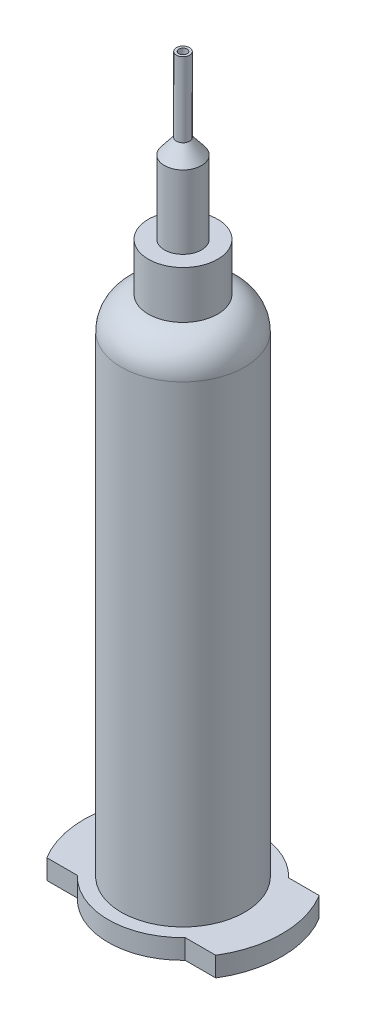
ISO-10303-21;
HEADER;
FILE_DESCRIPTION(('STEP AP214'),'2;1');
FILE_NAME('part.step','',(''),(''),'','','');
FILE_SCHEMA(('AUTOMOTIVE_DESIGN { 1 0 10303 214 1 1 1 1 }'));
ENDSEC;
DATA;
#1=APPLICATION_CONTEXT('core data for automotive mechanical design processes');
#2=APPLICATION_PROTOCOL_DEFINITION('international standard','automotive_design',2000,#1);
#3=PRODUCT_CONTEXT('',#1,'mechanical');
#4=PRODUCT('Part','Part','',(#3));
#5=PRODUCT_RELATED_PRODUCT_CATEGORY('part','',(#4));
#6=PRODUCT_DEFINITION_FORMATION('','',#4);
#7=PRODUCT_DEFINITION_CONTEXT('part definition',#1,'design');
#8=PRODUCT_DEFINITION('design','',#6,#7);
#9=PRODUCT_DEFINITION_SHAPE('','',#8);
#10=(LENGTH_UNIT() NAMED_UNIT(*) SI_UNIT(.MILLI.,.METRE.));
#11=(NAMED_UNIT(*) PLANE_ANGLE_UNIT() SI_UNIT($,.RADIAN.));
#12=(NAMED_UNIT(*) SI_UNIT($,.STERADIAN.) SOLID_ANGLE_UNIT());
#13=UNCERTAINTY_MEASURE_WITH_UNIT(LENGTH_MEASURE(1.E-05),#10,'distance_accuracy_value','');
#14=(GEOMETRIC_REPRESENTATION_CONTEXT(3) GLOBAL_UNCERTAINTY_ASSIGNED_CONTEXT((#13)) GLOBAL_UNIT_ASSIGNED_CONTEXT((#10,
#11,#12)) REPRESENTATION_CONTEXT('',''));
#15=CARTESIAN_POINT('',(0.,0.,0.));
#16=DIRECTION('',(0.,0.,1.));
#17=DIRECTION('',(1.,0.,0.));
#18=AXIS2_PLACEMENT_3D('',#15,#16,#17);
#19=CARTESIAN_POINT('',(0.,3.12000000000002,0.));
#20=DIRECTION('',(0.,1.,0.));
#21=DIRECTION('',(0.,0.,1.));
#22=AXIS2_PLACEMENT_3D('',#19,#20,#21);
#23=CYLINDRICAL_SURFACE('',#22,7.925);
#24=CARTESIAN_POINT('',(0.,3.12000000000002,0.));
#25=DIRECTION('',(0.,1.,0.));
#26=DIRECTION('',(0.,0.,1.));
#27=AXIS2_PLACEMENT_3D('',#24,#25,#26);
#28=CIRCLE('',#27,7.925);
#29=CARTESIAN_POINT('',(0.,3.12000000000002,7.925));
#30=VERTEX_POINT('',#29);
#31=EDGE_CURVE('E11',#30,#30,#28,.T.);
#32=ORIENTED_EDGE('',*,*,#31,.T.);
#33=EDGE_LOOP('',(#32));
#34=FACE_BOUND('',#33,.T.);
#35=CARTESIAN_POINT('',(0.,18.12,0.));
#36=DIRECTION('',(0.,1.,0.));
#37=DIRECTION('',(0.,0.,1.));
#38=AXIS2_PLACEMENT_3D('',#35,#36,#37);
#39=CIRCLE('',#38,7.925);
#40=CARTESIAN_POINT('',(0.,18.12,7.925));
#41=VERTEX_POINT('',#40);
#42=EDGE_CURVE('E52',#41,#41,#39,.T.);
#43=ORIENTED_EDGE('',*,*,#42,.F.);
#44=EDGE_LOOP('',(#43));
#45=FACE_BOUND('',#44,.T.);
#46=ADVANCED_FACE('F49',(#34,#45),#23,.T.);
#47=CARTESIAN_POINT('',(0.,3.12000000000002,0.));
#48=DIRECTION('',(0.,1.,0.));
#49=DIRECTION('',(0.,0.,1.));
#50=AXIS2_PLACEMENT_3D('',#47,#48,#49);
#51=PLANE('',#50);
#52=ORIENTED_EDGE('',*,*,#31,.F.);
#53=EDGE_LOOP('',(#52));
#54=FACE_BOUND('',#53,.T.);
#55=ADVANCED_FACE('F64',(#54),#51,.F.);
#56=CARTESIAN_POINT('',(0.,18.12,0.));
#57=DIRECTION('',(0.,1.,0.));
#58=DIRECTION('',(0.,0.,1.));
#59=AXIS2_PLACEMENT_3D('',#56,#57,#58);
#60=PLANE('',#59);
#61=ORIENTED_EDGE('',*,*,#42,.T.);
#62=EDGE_LOOP('',(#61));
#63=FACE_BOUND('',#62,.T.);
#64=ADVANCED_FACE('F61',(#63),#60,.T.);
#65=CLOSED_SHELL('',(#46,#55,#64));
#66=MANIFOLD_SOLID_BREP('B2',#65);
#67=CARTESIAN_POINT('',(0.,24.5223538498266,0.));
#68=DIRECTION('',(0.,1.,0.));
#69=DIRECTION('',(0.,0.,1.));
#70=AXIS2_PLACEMENT_3D('',#67,#68,#69);
#71=CYLINDRICAL_SURFACE('',#70,15.075);
#72=DIRECTION('',(0.,1.,0.));
#73=VECTOR('',#72,1.);
#74=CARTESIAN_POINT('',(-12.8545711713771,-82.5783145535444,-7.875));
#75=LINE('',#74,#73);
#76=CARTESIAN_POINT('',(-12.8545711713771,-55.88,-7.875));
#77=VERTEX_POINT('',#76);
#78=CARTESIAN_POINT('',(-12.8545711713771,-52.88,-7.875));
#79=VERTEX_POINT('',#78);
#80=EDGE_CURVE('E193',#77,#79,#75,.T.);
#81=ORIENTED_EDGE('',*,*,#80,.F.);
#82=CARTESIAN_POINT('',(0.,-55.88,0.));
#83=DIRECTION('',(0.,1.,0.));
#84=DIRECTION('',(0.,0.,1.));
#85=AXIS2_PLACEMENT_3D('',#82,#83,#84);
#86=CIRCLE('',#85,15.075);
#87=CARTESIAN_POINT('',(-12.8545711713772,-55.88,7.875));
#88=VERTEX_POINT('',#87);
#89=EDGE_CURVE('E182',#77,#88,#86,.T.);
#90=ORIENTED_EDGE('',*,*,#89,.T.);
#91=DIRECTION('',(0.,1.,0.));
#92=VECTOR('',#91,1.);
#93=CARTESIAN_POINT('',(-12.8545711713771,-82.5783145535444,7.875));
#94=LINE('',#93,#92);
#95=CARTESIAN_POINT('',(-12.8545711713771,-52.88,7.875));
#96=VERTEX_POINT('',#95);
#97=EDGE_CURVE('E111',#88,#96,#94,.T.);
#98=ORIENTED_EDGE('',*,*,#97,.T.);
#99=CARTESIAN_POINT('',(0.,-52.88,0.));
#100=DIRECTION('',(0.,1.,0.));
#101=DIRECTION('',(0.,0.,1.));
#102=AXIS2_PLACEMENT_3D('',#99,#100,#101);
#103=CIRCLE('',#102,15.075);
#104=EDGE_CURVE('E241',#79,#96,#103,.T.);
#105=ORIENTED_EDGE('',*,*,#104,.F.);
#106=EDGE_LOOP('',(#81,#90,#98,#105));
#107=FACE_BOUND('',#106,.T.);
#108=ADVANCED_FACE('F96',(#107),#71,.T.);
#109=CARTESIAN_POINT('',(0.,24.5223538498266,0.));
#110=DIRECTION('',(0.,1.,0.));
#111=DIRECTION('',(0.,0.,1.));
#112=AXIS2_PLACEMENT_3D('',#109,#110,#111);
#113=CYLINDRICAL_SURFACE('',#112,1.00000000000002);
#114=CARTESIAN_POINT('',(0.,44.53,0.));
#115=DIRECTION('',(0.,1.,0.));
#116=DIRECTION('',(0.,0.,1.));
#117=AXIS2_PLACEMENT_3D('',#114,#115,#116);
#118=CIRCLE('',#117,1.00000000000002);
#119=CARTESIAN_POINT('',(0.,44.53,1.00000000000002));
#120=VERTEX_POINT('',#119);
#121=EDGE_CURVE('E223',#120,#120,#118,.T.);
#122=ORIENTED_EDGE('',*,*,#121,.T.);
#123=EDGE_LOOP('',(#122));
#124=FACE_BOUND('',#123,.T.);
#125=CARTESIAN_POINT('',(0.,55.88,0.));
#126=DIRECTION('',(0.,1.,0.));
#127=DIRECTION('',(0.,0.,1.));
#128=AXIS2_PLACEMENT_3D('',#125,#126,#127);
#129=CIRCLE('',#128,1.00000000000001);
#130=CARTESIAN_POINT('',(0.,55.88,1.00000000000001));
#131=VERTEX_POINT('',#130);
#132=EDGE_CURVE('E196',#131,#131,#129,.T.);
#133=ORIENTED_EDGE('',*,*,#132,.F.);
#134=EDGE_LOOP('',(#133));
#135=FACE_BOUND('',#134,.T.);
#136=ADVANCED_FACE('F282',(#124,#135),#113,.T.);
#137=CARTESIAN_POINT('',(0.,55.88,0.));
#138=DIRECTION('',(0.,1.,0.));
#139=DIRECTION('',(0.,0.,1.));
#140=AXIS2_PLACEMENT_3D('',#137,#138,#139);
#141=PLANE('',#140);
#142=CARTESIAN_POINT('',(0.,55.88,0.));
#143=DIRECTION('',(0.,1.,0.));
#144=DIRECTION('',(0.,0.,1.));
#145=AXIS2_PLACEMENT_3D('',#142,#143,#144);
#146=CIRCLE('',#145,0.627370955077484);
#147=CARTESIAN_POINT('',(0.,55.88,0.627370955077484));
#148=VERTEX_POINT('',#147);
#149=EDGE_CURVE('E329',#148,#148,#146,.T.);
#150=ORIENTED_EDGE('',*,*,#149,.F.);
#151=EDGE_LOOP('',(#150));
#152=FACE_BOUND('',#151,.T.);
#153=ORIENTED_EDGE('',*,*,#132,.T.);
#154=EDGE_LOOP('',(#153));
#155=FACE_BOUND('',#154,.T.);
#156=ADVANCED_FACE('F280',(#152,#155),#141,.T.);
#157=CARTESIAN_POINT('',(0.,44.53,0.));
#158=DIRECTION('',(0.,-1.,0.));
#159=DIRECTION('',(0.,0.,-1.));
#160=AXIS2_PLACEMENT_3D('',#157,#158,#159);
#161=CONICAL_SURFACE('',#160,1.00000000000002,0.673903778153833);
#162=CARTESIAN_POINT('',(0.,42.2448308477729,0.));
#163=DIRECTION('',(0.,1.,0.));
#164=DIRECTION('',(0.,0.,1.));
#165=AXIS2_PLACEMENT_3D('',#162,#163,#164);
#166=CIRCLE('',#165,2.82500000000001);
#167=CARTESIAN_POINT('',(0.,42.2448308477729,2.82500000000001));
#168=VERTEX_POINT('',#167);
#169=EDGE_CURVE('E226',#168,#168,#166,.T.);
#170=ORIENTED_EDGE('',*,*,#169,.T.);
#171=EDGE_LOOP('',(#170));
#172=FACE_BOUND('',#171,.T.);
#173=ORIENTED_EDGE('',*,*,#121,.F.);
#174=EDGE_LOOP('',(#173));
#175=FACE_BOUND('',#174,.T.);
#176=ADVANCED_FACE('F274',(#172,#175),#161,.T.);
#177=CARTESIAN_POINT('',(0.,24.5223538498266,0.));
#178=DIRECTION('',(0.,1.,0.));
#179=DIRECTION('',(0.,0.,1.));
#180=AXIS2_PLACEMENT_3D('',#177,#178,#179);
#181=CYLINDRICAL_SURFACE('',#180,2.82500000000001);
#182=CARTESIAN_POINT('',(0.,31.12,0.));
#183=DIRECTION('',(0.,1.,0.));
#184=DIRECTION('',(0.,0.,1.));
#185=AXIS2_PLACEMENT_3D('',#182,#183,#184);
#186=CIRCLE('',#185,2.825);
#187=CARTESIAN_POINT('',(0.,31.12,2.825));
#188=VERTEX_POINT('',#187);
#189=EDGE_CURVE('E229',#188,#188,#186,.T.);
#190=ORIENTED_EDGE('',*,*,#189,.T.);
#191=EDGE_LOOP('',(#190));
#192=FACE_BOUND('',#191,.T.);
#193=ORIENTED_EDGE('',*,*,#169,.F.);
#194=EDGE_LOOP('',(#193));
#195=FACE_BOUND('',#194,.T.);
#196=ADVANCED_FACE('F268',(#192,#195),#181,.T.);
#197=CARTESIAN_POINT('',(0.,31.12,0.));
#198=DIRECTION('',(0.,1.,0.));
#199=DIRECTION('',(0.,0.,1.));
#200=AXIS2_PLACEMENT_3D('',#197,#198,#199);
#201=PLANE('',#200);
#202=CARTESIAN_POINT('',(0.,31.12,0.));
#203=DIRECTION('',(0.,1.,0.));
#204=DIRECTION('',(0.,0.,1.));
#205=AXIS2_PLACEMENT_3D('',#202,#203,#204);
#206=CIRCLE('',#205,5.27500000000001);
#207=CARTESIAN_POINT('',(0.,31.12,5.27500000000001));
#208=VERTEX_POINT('',#207);
#209=EDGE_CURVE('E232',#208,#208,#206,.T.);
#210=ORIENTED_EDGE('',*,*,#209,.T.);
#211=EDGE_LOOP('',(#210));
#212=FACE_BOUND('',#211,.T.);
#213=ORIENTED_EDGE('',*,*,#189,.F.);
#214=EDGE_LOOP('',(#213));
#215=FACE_BOUND('',#214,.T.);
#216=ADVANCED_FACE('F262',(#212,#215),#201,.T.);
#217=CARTESIAN_POINT('',(0.,24.5223538498266,0.));
#218=DIRECTION('',(0.,1.,0.));
#219=DIRECTION('',(0.,0.,1.));
#220=AXIS2_PLACEMENT_3D('',#217,#218,#219);
#221=CYLINDRICAL_SURFACE('',#220,5.27500000000001);
#222=CARTESIAN_POINT('',(0.,23.88,0.));
#223=DIRECTION('',(0.,1.,0.));
#224=DIRECTION('',(0.,0.,1.));
#225=AXIS2_PLACEMENT_3D('',#222,#223,#224);
#226=CIRCLE('',#225,5.27500000000001);
#227=CARTESIAN_POINT('',(0.,23.88,5.27500000000001));
#228=VERTEX_POINT('',#227);
#229=EDGE_CURVE('E235',#228,#228,#226,.T.);
#230=ORIENTED_EDGE('',*,*,#229,.T.);
#231=EDGE_LOOP('',(#230));
#232=FACE_BOUND('',#231,.T.);
#233=ORIENTED_EDGE('',*,*,#209,.F.);
#234=EDGE_LOOP('',(#233));
#235=FACE_BOUND('',#234,.T.);
#236=ADVANCED_FACE('F259',(#232,#235),#221,.T.);
#237=CARTESIAN_POINT('',(0.,24.5223538498266,0.));
#238=DIRECTION('',(0.,1.,0.));
#239=DIRECTION('',(0.,0.,1.));
#240=AXIS2_PLACEMENT_3D('',#237,#238,#239);
#241=CYLINDRICAL_SURFACE('',#240,9.40000000000001);
#242=CARTESIAN_POINT('',(0.,18.9571578331212,0.));
#243=DIRECTION('',(0.,1.,0.));
#244=DIRECTION('',(0.,0.,1.));
#245=AXIS2_PLACEMENT_3D('',#242,#243,#244);
#246=CIRCLE('',#245,9.40000000000001);
#247=CARTESIAN_POINT('',(0.,18.9571578331212,9.40000000000001));
#248=VERTEX_POINT('',#247);
#249=EDGE_CURVE('E104',#248,#248,#246,.F.);
#250=ORIENTED_EDGE('',*,*,#249,.T.);
#251=EDGE_LOOP('',(#250));
#252=FACE_BOUND('',#251,.T.);
#253=CARTESIAN_POINT('',(0.,-52.88,0.));
#254=DIRECTION('',(0.,1.,0.));
#255=DIRECTION('',(0.,0.,1.));
#256=AXIS2_PLACEMENT_3D('',#253,#254,#255);
#257=CIRCLE('',#256,9.40000000000002);
#258=CARTESIAN_POINT('',(0.,-52.88,9.40000000000002));
#259=VERTEX_POINT('',#258);
#260=EDGE_CURVE('E238',#259,#259,#257,.T.);
#261=ORIENTED_EDGE('',*,*,#260,.T.);
#262=EDGE_LOOP('',(#261));
#263=FACE_BOUND('',#262,.T.);
#264=ADVANCED_FACE('F250',(#252,#263),#241,.T.);
#265=CARTESIAN_POINT('',(0.,-52.88,0.));
#266=DIRECTION('',(0.,1.,0.));
#267=DIRECTION('',(0.,0.,1.));
#268=AXIS2_PLACEMENT_3D('',#265,#266,#267);
#269=PLANE('',#268);
#270=DIRECTION('',(1.,0.,0.));
#271=VECTOR('',#270,1.);
#272=CARTESIAN_POINT('',(-12.8545711713771,-52.88,-7.875));
#273=LINE('',#272,#271);
#274=CARTESIAN_POINT('',(-8.208227579691,-52.88,-7.875));
#275=VERTEX_POINT('',#274);
#276=EDGE_CURVE('E176',#79,#275,#273,.T.);
#277=ORIENTED_EDGE('',*,*,#276,.F.);
#278=ORIENTED_EDGE('',*,*,#104,.T.);
#279=DIRECTION('',(-1.,0.,0.));
#280=VECTOR('',#279,1.);
#281=CARTESIAN_POINT('',(-12.8545711713771,-52.88,7.875));
#282=LINE('',#281,#280);
#283=CARTESIAN_POINT('',(-8.208227579691,-52.88,7.875));
#284=VERTEX_POINT('',#283);
#285=EDGE_CURVE('E213',#284,#96,#282,.T.);
#286=ORIENTED_EDGE('',*,*,#285,.F.);
#287=CARTESIAN_POINT('',(0.,-52.88,0.));
#288=DIRECTION('',(0.,-1.,0.));
#289=DIRECTION('',(0.,0.,1.));
#290=AXIS2_PLACEMENT_3D('',#287,#288,#289);
#291=CIRCLE('',#290,11.375);
#292=CARTESIAN_POINT('',(8.208227579691,-52.88,7.875));
#293=VERTEX_POINT('',#292);
#294=EDGE_CURVE('E217',#293,#284,#291,.T.);
#295=ORIENTED_EDGE('',*,*,#294,.F.);
#296=DIRECTION('',(-1.,0.,0.));
#297=VECTOR('',#296,1.);
#298=CARTESIAN_POINT('',(8.208227579691,-52.88,7.875));
#299=LINE('',#298,#297);
#300=CARTESIAN_POINT('',(12.8545711713771,-52.88,7.875));
#301=VERTEX_POINT('',#300);
#302=EDGE_CURVE('E214',#301,#293,#299,.T.);
#303=ORIENTED_EDGE('',*,*,#302,.F.);
#304=CARTESIAN_POINT('',(12.8545711713771,-52.88,-7.875));
#305=VERTEX_POINT('',#304);
#306=EDGE_CURVE('E242',#301,#305,#103,.T.);
#307=ORIENTED_EDGE('',*,*,#306,.T.);
#308=DIRECTION('',(1.,0.,0.));
#309=VECTOR('',#308,1.);
#310=CARTESIAN_POINT('',(8.208227579691,-52.88,-7.875));
#311=LINE('',#310,#309);
#312=CARTESIAN_POINT('',(8.208227579691,-52.88,-7.875));
#313=VERTEX_POINT('',#312);
#314=EDGE_CURVE('E183',#313,#305,#311,.T.);
#315=ORIENTED_EDGE('',*,*,#314,.F.);
#316=CARTESIAN_POINT('',(0.,-52.88,0.));
#317=DIRECTION('',(0.,-1.,0.));
#318=DIRECTION('',(0.,0.,-1.));
#319=AXIS2_PLACEMENT_3D('',#316,#317,#318);
#320=CIRCLE('',#319,11.375);
#321=EDGE_CURVE('E185',#275,#313,#320,.T.);
#322=ORIENTED_EDGE('',*,*,#321,.F.);
#323=EDGE_LOOP('',(#277,#278,#286,#295,#303,#307,#315,#322));
#324=FACE_BOUND('',#323,.T.);
#325=ORIENTED_EDGE('',*,*,#260,.F.);
#326=EDGE_LOOP('',(#325));
#327=FACE_BOUND('',#326,.T.);
#328=ADVANCED_FACE('F306',(#324,#327),#269,.T.);
#329=DIRECTION('',(0.,1.,0.));
#330=VECTOR('',#329,1.);
#331=CARTESIAN_POINT('',(12.8545711713771,-82.5783145535444,-7.875));
#332=LINE('',#331,#330);
#333=CARTESIAN_POINT('',(12.8545711713772,-55.88,-7.875));
#334=VERTEX_POINT('',#333);
#335=EDGE_CURVE('E119',#334,#305,#332,.T.);
#336=ORIENTED_EDGE('',*,*,#335,.T.);
#337=ORIENTED_EDGE('',*,*,#306,.F.);
#338=DIRECTION('',(0.,1.,0.));
#339=VECTOR('',#338,1.);
#340=CARTESIAN_POINT('',(12.8545711713771,-82.5783145535444,7.875));
#341=LINE('',#340,#339);
#342=CARTESIAN_POINT('',(12.8545711713771,-55.88,7.875));
#343=VERTEX_POINT('',#342);
#344=EDGE_CURVE('E197',#343,#301,#341,.T.);
#345=ORIENTED_EDGE('',*,*,#344,.F.);
#346=EDGE_CURVE('E245',#343,#334,#86,.T.);
#347=ORIENTED_EDGE('',*,*,#346,.T.);
#348=EDGE_LOOP('',(#336,#337,#345,#347));
#349=FACE_BOUND('',#348,.T.);
#350=ADVANCED_FACE('F300',(#349),#71,.T.);
#351=CARTESIAN_POINT('',(0.,-55.88,0.));
#352=DIRECTION('',(0.,-1.,0.));
#353=DIRECTION('',(0.,0.,-1.));
#354=AXIS2_PLACEMENT_3D('',#351,#352,#353);
#355=PLANE('',#354);
#356=CARTESIAN_POINT('',(0.,-55.88,0.));
#357=DIRECTION('',(0.,-1.,0.));
#358=DIRECTION('',(0.,0.,-1.));
#359=AXIS2_PLACEMENT_3D('',#356,#357,#358);
#360=CIRCLE('',#359,7.925);
#361=CARTESIAN_POINT('',(0.,-55.88,-7.925));
#362=VERTEX_POINT('',#361);
#363=EDGE_CURVE('E326',#362,#362,#360,.T.);
#364=ORIENTED_EDGE('',*,*,#363,.F.);
#365=EDGE_LOOP('',(#364));
#366=FACE_BOUND('',#365,.T.);
#367=DIRECTION('',(1.,0.,0.));
#368=VECTOR('',#367,1.);
#369=CARTESIAN_POINT('',(-12.8545711713771,-55.88,-7.875));
#370=LINE('',#369,#368);
#371=CARTESIAN_POINT('',(-8.208227579691,-55.88,-7.875));
#372=VERTEX_POINT('',#371);
#373=EDGE_CURVE('E173',#77,#372,#370,.T.);
#374=ORIENTED_EDGE('',*,*,#373,.T.);
#375=CARTESIAN_POINT('',(0.,-55.88,0.));
#376=DIRECTION('',(0.,-1.,0.));
#377=DIRECTION('',(0.,0.,-1.));
#378=AXIS2_PLACEMENT_3D('',#375,#376,#377);
#379=CIRCLE('',#378,11.375);
#380=CARTESIAN_POINT('',(8.208227579691,-55.88,-7.875));
#381=VERTEX_POINT('',#380);
#382=EDGE_CURVE('E161',#372,#381,#379,.T.);
#383=ORIENTED_EDGE('',*,*,#382,.T.);
#384=DIRECTION('',(1.,0.,0.));
#385=VECTOR('',#384,1.);
#386=CARTESIAN_POINT('',(8.208227579691,-55.88,-7.875));
#387=LINE('',#386,#385);
#388=EDGE_CURVE('E190',#381,#334,#387,.T.);
#389=ORIENTED_EDGE('',*,*,#388,.T.);
#390=ORIENTED_EDGE('',*,*,#346,.F.);
#391=DIRECTION('',(-1.,0.,0.));
#392=VECTOR('',#391,1.);
#393=CARTESIAN_POINT('',(8.208227579691,-55.88,7.875));
#394=LINE('',#393,#392);
#395=CARTESIAN_POINT('',(8.208227579691,-55.88,7.875));
#396=VERTEX_POINT('',#395);
#397=EDGE_CURVE('E202',#343,#396,#394,.T.);
#398=ORIENTED_EDGE('',*,*,#397,.T.);
#399=CARTESIAN_POINT('',(0.,-55.88,0.));
#400=DIRECTION('',(0.,-1.,0.));
#401=DIRECTION('',(0.,0.,-1.));
#402=AXIS2_PLACEMENT_3D('',#399,#400,#401);
#403=CIRCLE('',#402,11.375);
#404=CARTESIAN_POINT('',(-8.208227579691,-55.88,7.875));
#405=VERTEX_POINT('',#404);
#406=EDGE_CURVE('E203',#396,#405,#403,.T.);
#407=ORIENTED_EDGE('',*,*,#406,.T.);
#408=DIRECTION('',(-1.,0.,0.));
#409=VECTOR('',#408,1.);
#410=CARTESIAN_POINT('',(-12.8545711713771,-55.88,7.875));
#411=LINE('',#410,#409);
#412=EDGE_CURVE('E206',#405,#88,#411,.T.);
#413=ORIENTED_EDGE('',*,*,#412,.T.);
#414=ORIENTED_EDGE('',*,*,#89,.F.);
#415=EDGE_LOOP('',(#374,#383,#389,#390,#398,#407,#413,#414));
#416=FACE_BOUND('',#415,.T.);
#417=ADVANCED_FACE('F180',(#366,#416),#355,.T.);
#418=CARTESIAN_POINT('',(0.,18.9571578331212,0.));
#419=DIRECTION('',(0.,1.,0.));
#420=DIRECTION('',(0.,0.,1.));
#421=AXIS2_PLACEMENT_3D('',#418,#419,#420);
#422=DEGENERATE_TOROIDAL_SURFACE('',#421,4.40000000000001,5.,.T.);
#423=ORIENTED_EDGE('',*,*,#249,.F.);
#424=EDGE_LOOP('',(#423));
#425=FACE_BOUND('',#424,.T.);
#426=ORIENTED_EDGE('',*,*,#229,.F.);
#427=EDGE_LOOP('',(#426));
#428=FACE_BOUND('',#427,.T.);
#429=ADVANCED_FACE('F253',(#425,#428),#422,.T.);
#430=CARTESIAN_POINT('',(8.208227579691,-82.5783145535444,7.875));
#431=DIRECTION('',(0.,0.,-1.));
#432=DIRECTION('',(-1.,0.,0.));
#433=AXIS2_PLACEMENT_3D('',#430,#431,#432);
#434=PLANE('',#433);
#435=ORIENTED_EDGE('',*,*,#344,.T.);
#436=ORIENTED_EDGE('',*,*,#302,.T.);
#437=DIRECTION('',(0.,1.,0.));
#438=VECTOR('',#437,1.);
#439=CARTESIAN_POINT('',(8.208227579691,-82.5783145535444,7.875));
#440=LINE('',#439,#438);
#441=EDGE_CURVE('E200',#396,#293,#440,.T.);
#442=ORIENTED_EDGE('',*,*,#441,.F.);
#443=ORIENTED_EDGE('',*,*,#397,.F.);
#444=EDGE_LOOP('',(#435,#436,#442,#443));
#445=FACE_BOUND('',#444,.T.);
#446=ADVANCED_FACE('F256',(#445),#434,.F.);
#447=CARTESIAN_POINT('',(0.,-82.5783145535444,0.));
#448=DIRECTION('',(0.,1.,0.));
#449=DIRECTION('',(0.,0.,1.));
#450=AXIS2_PLACEMENT_3D('',#447,#448,#449);
#451=CYLINDRICAL_SURFACE('',#450,11.375);
#452=ORIENTED_EDGE('',*,*,#441,.T.);
#453=ORIENTED_EDGE('',*,*,#294,.T.);
#454=DIRECTION('',(0.,1.,0.));
#455=VECTOR('',#454,1.);
#456=CARTESIAN_POINT('',(-8.208227579691,-82.5783145535444,7.875));
#457=LINE('',#456,#455);
#458=EDGE_CURVE('E204',#405,#284,#457,.T.);
#459=ORIENTED_EDGE('',*,*,#458,.F.);
#460=ORIENTED_EDGE('',*,*,#406,.F.);
#461=EDGE_LOOP('',(#452,#453,#459,#460));
#462=FACE_BOUND('',#461,.T.);
#463=ADVANCED_FACE('F356',(#462),#451,.T.);
#464=CARTESIAN_POINT('',(-12.8545711713771,-82.5783145535444,7.875));
#465=DIRECTION('',(0.,0.,-1.));
#466=DIRECTION('',(-1.,0.,0.));
#467=AXIS2_PLACEMENT_3D('',#464,#465,#466);
#468=PLANE('',#467);
#469=ORIENTED_EDGE('',*,*,#458,.T.);
#470=ORIENTED_EDGE('',*,*,#285,.T.);
#471=ORIENTED_EDGE('',*,*,#97,.F.);
#472=ORIENTED_EDGE('',*,*,#412,.F.);
#473=EDGE_LOOP('',(#469,#470,#471,#472));
#474=FACE_BOUND('',#473,.T.);
#475=ADVANCED_FACE('F353',(#474),#468,.F.);
#476=CARTESIAN_POINT('',(-12.8545711713771,-82.5783145535444,-7.875));
#477=DIRECTION('',(0.,0.,1.));
#478=DIRECTION('',(1.,0.,0.));
#479=AXIS2_PLACEMENT_3D('',#476,#477,#478);
#480=PLANE('',#479);
#481=ORIENTED_EDGE('',*,*,#80,.T.);
#482=ORIENTED_EDGE('',*,*,#276,.T.);
#483=DIRECTION('',(0.,1.,0.));
#484=VECTOR('',#483,1.);
#485=CARTESIAN_POINT('',(-8.208227579691,-82.5783145535444,-7.875));
#486=LINE('',#485,#484);
#487=EDGE_CURVE('E165',#372,#275,#486,.T.);
#488=ORIENTED_EDGE('',*,*,#487,.F.);
#489=ORIENTED_EDGE('',*,*,#373,.F.);
#490=EDGE_LOOP('',(#481,#482,#488,#489));
#491=FACE_BOUND('',#490,.T.);
#492=ADVANCED_FACE('F172',(#491),#480,.F.);
#493=CARTESIAN_POINT('',(0.,-82.5783145535444,0.));
#494=DIRECTION('',(0.,1.,0.));
#495=DIRECTION('',(0.,0.,1.));
#496=AXIS2_PLACEMENT_3D('',#493,#494,#495);
#497=CYLINDRICAL_SURFACE('',#496,11.375);
#498=ORIENTED_EDGE('',*,*,#487,.T.);
#499=ORIENTED_EDGE('',*,*,#321,.T.);
#500=DIRECTION('',(0.,1.,0.));
#501=VECTOR('',#500,1.);
#502=CARTESIAN_POINT('',(8.208227579691,-82.5783145535444,-7.875));
#503=LINE('',#502,#501);
#504=EDGE_CURVE('E167',#381,#313,#503,.T.);
#505=ORIENTED_EDGE('',*,*,#504,.F.);
#506=ORIENTED_EDGE('',*,*,#382,.F.);
#507=EDGE_LOOP('',(#498,#499,#505,#506));
#508=FACE_BOUND('',#507,.T.);
#509=ADVANCED_FACE('F163',(#508),#497,.T.);
#510=CARTESIAN_POINT('',(8.208227579691,-82.5783145535444,-7.875));
#511=DIRECTION('',(0.,0.,1.));
#512=DIRECTION('',(1.,0.,0.));
#513=AXIS2_PLACEMENT_3D('',#510,#511,#512);
#514=PLANE('',#513);
#515=ORIENTED_EDGE('',*,*,#504,.T.);
#516=ORIENTED_EDGE('',*,*,#314,.T.);
#517=ORIENTED_EDGE('',*,*,#335,.F.);
#518=ORIENTED_EDGE('',*,*,#388,.F.);
#519=EDGE_LOOP('',(#515,#516,#517,#518));
#520=FACE_BOUND('',#519,.T.);
#521=ADVANCED_FACE('F324',(#520),#514,.F.);
#522=CARTESIAN_POINT('',(0.,18.12,0.));
#523=DIRECTION('',(0.,-1.,0.));
#524=DIRECTION('',(0.,0.,-1.));
#525=AXIS2_PLACEMENT_3D('',#522,#523,#524);
#526=CYLINDRICAL_SURFACE('',#525,7.925);
#527=CARTESIAN_POINT('',(0.,18.12,0.));
#528=DIRECTION('',(0.,-1.,0.));
#529=DIRECTION('',(0.,0.,-1.));
#530=AXIS2_PLACEMENT_3D('',#527,#528,#529);
#531=CIRCLE('',#530,7.925);
#532=CARTESIAN_POINT('',(0.,18.12,-7.925));
#533=VERTEX_POINT('',#532);
#534=EDGE_CURVE('E199',#533,#533,#531,.T.);
#535=ORIENTED_EDGE('',*,*,#534,.F.);
#536=EDGE_LOOP('',(#535));
#537=FACE_BOUND('',#536,.T.);
#538=ORIENTED_EDGE('',*,*,#363,.T.);
#539=EDGE_LOOP('',(#538));
#540=FACE_BOUND('',#539,.T.);
#541=ADVANCED_FACE('F336',(#537,#540),#526,.F.);
#542=CARTESIAN_POINT('',(0.,14.88,0.));
#543=DIRECTION('',(0.,1.,0.));
#544=DIRECTION('',(0.,0.,1.));
#545=AXIS2_PLACEMENT_3D('',#542,#543,#544);
#546=CYLINDRICAL_SURFACE('',#545,0.627370955077484);
#547=CARTESIAN_POINT('',(0.,27.7479380565703,0.));
#548=DIRECTION('',(0.,-1.,0.));
#549=DIRECTION('',(0.,0.,-1.));
#550=AXIS2_PLACEMENT_3D('',#547,#548,#549);
#551=CIRCLE('',#550,0.627370955077484);
#552=CARTESIAN_POINT('',(0.,27.7479380565703,-0.627370955077484));
#553=VERTEX_POINT('',#552);
#554=EDGE_CURVE('E47',#553,#553,#551,.T.);
#555=ORIENTED_EDGE('',*,*,#554,.T.);
#556=EDGE_LOOP('',(#555));
#557=FACE_BOUND('',#556,.T.);
#558=ORIENTED_EDGE('',*,*,#149,.T.);
#559=EDGE_LOOP('',(#558));
#560=FACE_BOUND('',#559,.T.);
#561=ADVANCED_FACE('F334',(#557,#560),#546,.F.);
#562=CARTESIAN_POINT('',(0.,27.7479380565703,0.));
#563=DIRECTION('',(0.,-1.,0.));
#564=DIRECTION('',(0.,0.,-1.));
#565=AXIS2_PLACEMENT_3D('',#562,#563,#564);
#566=TOROIDAL_SURFACE('',#565,10.6273709550775,10.);
#567=ORIENTED_EDGE('',*,*,#534,.T.);
#568=EDGE_LOOP('',(#567));
#569=FACE_BOUND('',#568,.T.);
#570=ORIENTED_EDGE('',*,*,#554,.F.);
#571=EDGE_LOOP('',(#570));
#572=FACE_BOUND('',#571,.T.);
#573=ADVANCED_FACE('F98',(#569,#572),#566,.T.);
#574=CLOSED_SHELL('',(#108,#136,#156,#176,#196,#216,#236,#264,#328,#350,#417,#429,#446,#463,
#475,#492,#509,#521,#541,#561,#573));
#575=MANIFOLD_SOLID_BREP('B6',#574);
#576=ADVANCED_BREP_SHAPE_REPRESENTATION('',(#18,#66,#575),#14);
#577=SHAPE_DEFINITION_REPRESENTATION(#9,#576);
ENDSEC;
END-ISO-10303-21;
